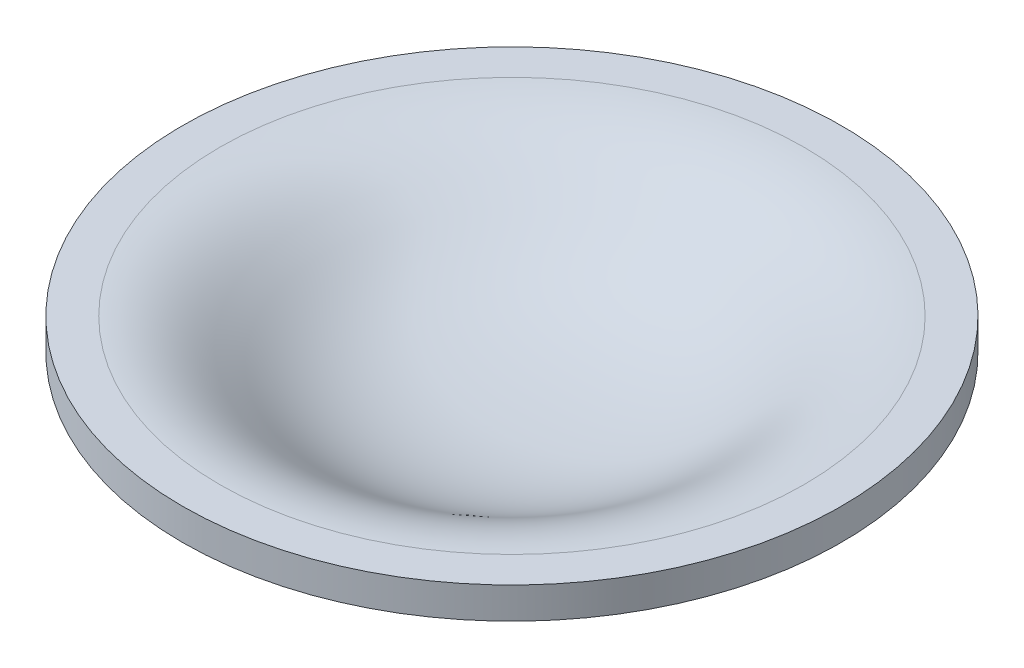
ISO-10303-21;
HEADER;
FILE_DESCRIPTION(('STEP AP214'),'2;1');
FILE_NAME('part.step','',(''),(''),'','','');
FILE_SCHEMA(('AUTOMOTIVE_DESIGN { 1 0 10303 214 1 1 1 1 }'));
ENDSEC;
DATA;
#1=APPLICATION_CONTEXT('core data for automotive mechanical design processes');
#2=APPLICATION_PROTOCOL_DEFINITION('international standard','automotive_design',2000,#1);
#3=PRODUCT_CONTEXT('',#1,'mechanical');
#4=PRODUCT('Part','Part','',(#3));
#5=PRODUCT_RELATED_PRODUCT_CATEGORY('part','',(#4));
#6=PRODUCT_DEFINITION_FORMATION('','',#4);
#7=PRODUCT_DEFINITION_CONTEXT('part definition',#1,'design');
#8=PRODUCT_DEFINITION('design','',#6,#7);
#9=PRODUCT_DEFINITION_SHAPE('','',#8);
#10=(LENGTH_UNIT() NAMED_UNIT(*) SI_UNIT(.MILLI.,.METRE.));
#11=(NAMED_UNIT(*) PLANE_ANGLE_UNIT() SI_UNIT($,.RADIAN.));
#12=(NAMED_UNIT(*) SI_UNIT($,.STERADIAN.) SOLID_ANGLE_UNIT());
#13=UNCERTAINTY_MEASURE_WITH_UNIT(LENGTH_MEASURE(1.E-05),#10,'distance_accuracy_value','');
#14=(GEOMETRIC_REPRESENTATION_CONTEXT(3) GLOBAL_UNCERTAINTY_ASSIGNED_CONTEXT((#13)) GLOBAL_UNIT_ASSIGNED_CONTEXT((#10,
#11,#12)) REPRESENTATION_CONTEXT('',''));
#15=CARTESIAN_POINT('',(0.,0.,0.));
#16=DIRECTION('',(0.,0.,1.));
#17=DIRECTION('',(1.,0.,0.));
#18=AXIS2_PLACEMENT_3D('',#15,#16,#17);
#19=CARTESIAN_POINT('',(0.,0.,0.));
#20=CARTESIAN_POINT('',(63.6710055935532,0.,0.));
#21=CARTESIAN_POINT('',(65.8747505628269,30.,0.));
#22=CARTESIAN_POINT('',(93.0884124264324,30.,0.));
#23=B_SPLINE_CURVE_WITH_KNOTS('',3,(#19,#20,#21,#22),.UNSPECIFIED.,.F.,.F.,(4,4),(0.,1.),.UNSPECIFIED.);
#24=CARTESIAN_POINT('',(0.,0.,0.));
#25=DIRECTION('',(0.,1.,0.));
#26=AXIS1_PLACEMENT('',#24,#25);
#27=SURFACE_OF_REVOLUTION('',#23,#26);
#28=CARTESIAN_POINT('',(0.,30.,0.));
#29=DIRECTION('',(0.,1.,0.));
#30=DIRECTION('',(0.,0.,1.));
#31=AXIS2_PLACEMENT_3D('',#28,#29,#30);
#32=CIRCLE('',#31,93.0884124264324);
#33=CARTESIAN_POINT('',(0.,30.,93.0884124264324));
#34=VERTEX_POINT('',#33);
#35=EDGE_CURVE('E70',#34,#34,#32,.T.);
#36=ORIENTED_EDGE('',*,*,#35,.F.);
#37=EDGE_LOOP('',(#36));
#38=FACE_BOUND('',#37,.T.);
#39=CARTESIAN_POINT('',(0.,0.,0.));
#40=VERTEX_POINT('',#39);
#41=VERTEX_LOOP('',#40);
#42=FACE_BOUND('',#41,.T.);
#43=ADVANCED_FACE('F41',(#38,#42),#27,.T.);
#44=CARTESIAN_POINT('',(93.0884124264324,40.,0.));
#45=CARTESIAN_POINT('',(92.0261996190065,40.,0.));
#46=CARTESIAN_POINT('',(89.8767192256323,39.9254110165071,0.));
#47=CARTESIAN_POINT('',(85.7936324678341,39.48594165415,0.));
#48=CARTESIAN_POINT('',(80.9711558236741,38.4157129922728,0.));
#49=CARTESIAN_POINT('',(75.7475616972223,36.4646928445173,0.));
#50=CARTESIAN_POINT('',(69.5015709814748,33.2799526259586,0.));
#51=CARTESIAN_POINT('',(62.7696133723169,28.7580146079751,0.));
#52=CARTESIAN_POINT('',(55.0471990453445,23.3980713236191,0.));
#53=CARTESIAN_POINT('',(47.8133531794759,19.2524902106688,0.));
#54=CARTESIAN_POINT('',(40.8755346382984,16.2619370602766,0.));
#55=CARTESIAN_POINT('',(34.9183601714162,14.2353878167292,0.));
#56=CARTESIAN_POINT('',(28.0346174506374,12.4944519982928,0.));
#57=CARTESIAN_POINT('',(21.3900025780629,11.3532050292762,0.));
#58=CARTESIAN_POINT('',(15.4531746905139,10.673913572141,0.));
#59=CARTESIAN_POINT('',(10.675004763726,10.2938328070813,0.));
#60=CARTESIAN_POINT('',(6.39895066116124,10.0953937943061,0.));
#61=CARTESIAN_POINT('',(2.81294298110194,10.0139259934207,0.));
#62=CARTESIAN_POINT('',(0.930194341011259,10.,0.));
#63=CARTESIAN_POINT('',(0.,10.,0.));
#64=B_SPLINE_CURVE_WITH_KNOTS('',3,(#44,#45,#46,#47,#48,#49,#50,#51,#52,#53,#54,#55,#56,#57,#58,
#59,#60,#61,#62,#63),.UNSPECIFIED.,.F.,.F.,(4,1,1,1,1,1,1,1,1,1,1,1,1,1,1,1,1,4),(0.,0.03125,
0.0625,0.125,0.1875,0.25,0.375,0.5,0.625,0.6875,0.75,0.8125,0.875,0.90625,0.9375,0.96875,
0.984375,1.),.UNSPECIFIED.);
#65=CARTESIAN_POINT('',(0.,0.,0.));
#66=DIRECTION('',(0.,1.,0.));
#67=AXIS1_PLACEMENT('',#65,#66);
#68=SURFACE_OF_REVOLUTION('',#64,#67);
#69=CARTESIAN_POINT('',(0.,10.,0.));
#70=VERTEX_POINT('',#69);
#71=VERTEX_LOOP('',#70);
#72=FACE_BOUND('',#71,.T.);
#73=CARTESIAN_POINT('',(0.,40.,0.));
#74=DIRECTION('',(0.,1.,0.));
#75=DIRECTION('',(0.,0.,1.));
#76=AXIS2_PLACEMENT_3D('',#73,#74,#75);
#77=CIRCLE('',#76,93.0884124264324);
#78=CARTESIAN_POINT('',(0.,40.,93.0884124264324));
#79=VERTEX_POINT('',#78);
#80=EDGE_CURVE('E11',#79,#79,#77,.T.);
#81=ORIENTED_EDGE('',*,*,#80,.T.);
#82=EDGE_LOOP('',(#81));
#83=FACE_BOUND('',#82,.T.);
#84=ADVANCED_FACE('F55',(#72,#83),#68,.T.);
#85=CARTESIAN_POINT('',(105.,40.,0.));
#86=DIRECTION('',(0.,-1.,0.));
#87=DIRECTION('',(0.,0.,-1.));
#88=AXIS2_PLACEMENT_3D('',#85,#86,#87);
#89=PLANE('',#88);
#90=ORIENTED_EDGE('',*,*,#80,.F.);
#91=EDGE_LOOP('',(#90));
#92=FACE_BOUND('',#91,.T.);
#93=CARTESIAN_POINT('',(0.,40.,0.));
#94=DIRECTION('',(0.,1.,0.));
#95=DIRECTION('',(0.,0.,1.));
#96=AXIS2_PLACEMENT_3D('',#93,#94,#95);
#97=CIRCLE('',#96,105.);
#98=CARTESIAN_POINT('',(0.,40.,105.));
#99=VERTEX_POINT('',#98);
#100=EDGE_CURVE('E49',#99,#99,#97,.T.);
#101=ORIENTED_EDGE('',*,*,#100,.T.);
#102=EDGE_LOOP('',(#101));
#103=FACE_BOUND('',#102,.T.);
#104=ADVANCED_FACE('F58',(#92,#103),#89,.F.);
#105=CARTESIAN_POINT('',(0.,0.,0.));
#106=DIRECTION('',(0.,1.,0.));
#107=DIRECTION('',(0.,0.,1.));
#108=AXIS2_PLACEMENT_3D('',#105,#106,#107);
#109=CYLINDRICAL_SURFACE('',#108,105.);
#110=ORIENTED_EDGE('',*,*,#100,.F.);
#111=EDGE_LOOP('',(#110));
#112=FACE_BOUND('',#111,.T.);
#113=CARTESIAN_POINT('',(0.,30.,0.));
#114=DIRECTION('',(0.,1.,0.));
#115=DIRECTION('',(0.,0.,1.));
#116=AXIS2_PLACEMENT_3D('',#113,#114,#115);
#117=CIRCLE('',#116,105.);
#118=CARTESIAN_POINT('',(0.,30.,105.));
#119=VERTEX_POINT('',#118);
#120=EDGE_CURVE('E68',#119,#119,#117,.T.);
#121=ORIENTED_EDGE('',*,*,#120,.T.);
#122=EDGE_LOOP('',(#121));
#123=FACE_BOUND('',#122,.T.);
#124=ADVANCED_FACE('F63',(#112,#123),#109,.T.);
#125=CARTESIAN_POINT('',(105.,30.,0.));
#126=DIRECTION('',(0.,1.,0.));
#127=DIRECTION('',(0.,0.,1.));
#128=AXIS2_PLACEMENT_3D('',#125,#126,#127);
#129=PLANE('',#128);
#130=ORIENTED_EDGE('',*,*,#120,.F.);
#131=EDGE_LOOP('',(#130));
#132=FACE_BOUND('',#131,.T.);
#133=ORIENTED_EDGE('',*,*,#35,.T.);
#134=EDGE_LOOP('',(#133));
#135=FACE_BOUND('',#134,.T.);
#136=ADVANCED_FACE('F87',(#132,#135),#129,.F.);
#137=CLOSED_SHELL('',(#43,#84,#104,#124,#136));
#138=MANIFOLD_SOLID_BREP('B2',#137);
#139=ADVANCED_BREP_SHAPE_REPRESENTATION('',(#18,#138),#14);
#140=SHAPE_DEFINITION_REPRESENTATION(#9,#139);
ENDSEC;
END-ISO-10303-21;
